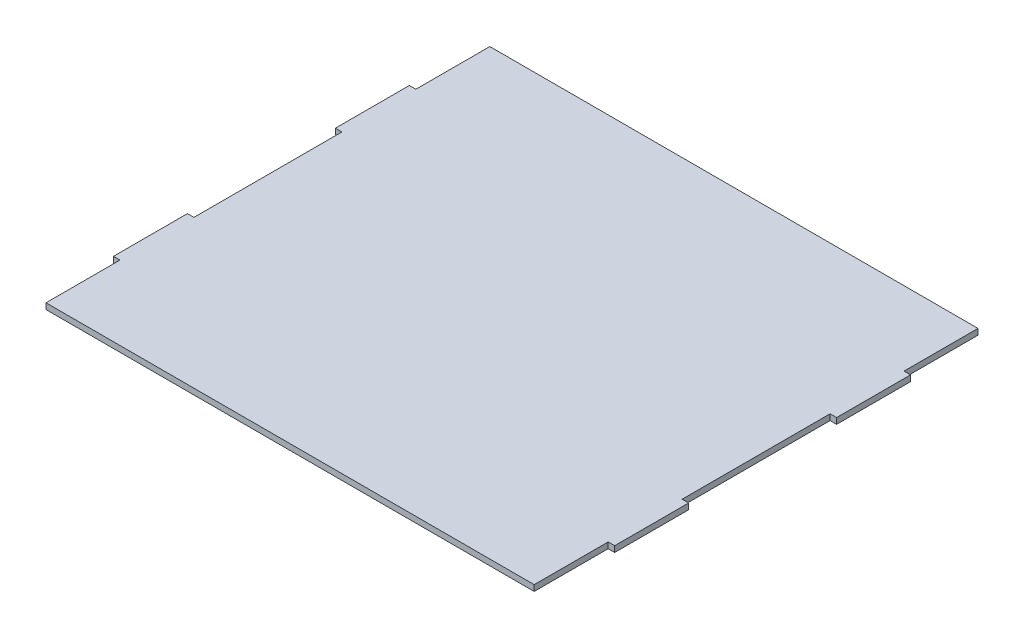
ISO-10303-21;
HEADER;
FILE_DESCRIPTION(('STEP AP214'),'2;1');
FILE_NAME('part.step','',(''),(''),'','','');
FILE_SCHEMA(('AUTOMOTIVE_DESIGN { 1 0 10303 214 1 1 1 1 }'));
ENDSEC;
DATA;
#1=APPLICATION_CONTEXT('core data for automotive mechanical design processes');
#2=APPLICATION_PROTOCOL_DEFINITION('international standard','automotive_design',2000,#1);
#3=PRODUCT_CONTEXT('',#1,'mechanical');
#4=PRODUCT('Part','Part','',(#3));
#5=PRODUCT_RELATED_PRODUCT_CATEGORY('part','',(#4));
#6=PRODUCT_DEFINITION_FORMATION('','',#4);
#7=PRODUCT_DEFINITION_CONTEXT('part definition',#1,'design');
#8=PRODUCT_DEFINITION('design','',#6,#7);
#9=PRODUCT_DEFINITION_SHAPE('','',#8);
#10=(LENGTH_UNIT() NAMED_UNIT(*) SI_UNIT(.MILLI.,.METRE.));
#11=(NAMED_UNIT(*) PLANE_ANGLE_UNIT() SI_UNIT($,.RADIAN.));
#12=(NAMED_UNIT(*) SI_UNIT($,.STERADIAN.) SOLID_ANGLE_UNIT());
#13=UNCERTAINTY_MEASURE_WITH_UNIT(LENGTH_MEASURE(1.E-05),#10,'distance_accuracy_value','');
#14=(GEOMETRIC_REPRESENTATION_CONTEXT(3) GLOBAL_UNCERTAINTY_ASSIGNED_CONTEXT((#13)) GLOBAL_UNIT_ASSIGNED_CONTEXT((#10,
#11,#12)) REPRESENTATION_CONTEXT('',''));
#15=CARTESIAN_POINT('',(0.,0.,0.));
#16=DIRECTION('',(0.,0.,1.));
#17=DIRECTION('',(1.,0.,0.));
#18=AXIS2_PLACEMENT_3D('',#15,#16,#17);
#19=CARTESIAN_POINT('',(84.7,2.,-75.));
#20=DIRECTION('',(-1.,0.,0.));
#21=DIRECTION('',(0.,0.,1.));
#22=AXIS2_PLACEMENT_3D('',#19,#20,#21);
#23=PLANE('',#22);
#24=DIRECTION('',(0.,0.,-1.));
#25=VECTOR('',#24,1.);
#26=CARTESIAN_POINT('',(84.7,2.,-75.));
#27=LINE('',#26,#25);
#28=CARTESIAN_POINT('',(84.7000000000008,2.,50.));
#29=VERTEX_POINT('',#28);
#30=CARTESIAN_POINT('',(84.7000000000007,2.,25.));
#31=VERTEX_POINT('',#30);
#32=EDGE_CURVE('E243',#29,#31,#27,.T.);
#33=ORIENTED_EDGE('',*,*,#32,.F.);
#34=DIRECTION('',(0.,1.,0.));
#35=VECTOR('',#34,1.);
#36=CARTESIAN_POINT('',(84.7000000000008,0.,50.));
#37=LINE('',#36,#35);
#38=CARTESIAN_POINT('',(84.7000000000008,0.,50.));
#39=VERTEX_POINT('',#38);
#40=EDGE_CURVE('E369',#39,#29,#37,.T.);
#41=ORIENTED_EDGE('',*,*,#40,.F.);
#42=DIRECTION('',(0.,0.,-1.));
#43=VECTOR('',#42,1.);
#44=CARTESIAN_POINT('',(84.7,0.,-75.));
#45=LINE('',#44,#43);
#46=CARTESIAN_POINT('',(84.7000000000007,0.,25.));
#47=VERTEX_POINT('',#46);
#48=EDGE_CURVE('E209',#39,#47,#45,.T.);
#49=ORIENTED_EDGE('',*,*,#48,.T.);
#50=DIRECTION('',(0.,1.,0.));
#51=VECTOR('',#50,1.);
#52=CARTESIAN_POINT('',(84.7000000000007,0.,25.));
#53=LINE('',#52,#51);
#54=EDGE_CURVE('E365',#47,#31,#53,.T.);
#55=ORIENTED_EDGE('',*,*,#54,.T.);
#56=EDGE_LOOP('',(#33,#41,#49,#55));
#57=FACE_BOUND('',#56,.T.);
#58=ADVANCED_FACE('F43',(#57),#23,.F.);
#59=CARTESIAN_POINT('',(-84.7,2.,-75.));
#60=DIRECTION('',(1.,0.,0.));
#61=DIRECTION('',(0.,0.,-1.));
#62=AXIS2_PLACEMENT_3D('',#59,#60,#61);
#63=PLANE('',#62);
#64=DIRECTION('',(0.,0.,1.));
#65=VECTOR('',#64,1.);
#66=CARTESIAN_POINT('',(-84.7,2.,-75.));
#67=LINE('',#66,#65);
#68=CARTESIAN_POINT('',(-84.7,2.,-50.));
#69=VERTEX_POINT('',#68);
#70=CARTESIAN_POINT('',(-84.7,2.,-25.));
#71=VERTEX_POINT('',#70);
#72=EDGE_CURVE('E53',#69,#71,#67,.T.);
#73=ORIENTED_EDGE('',*,*,#72,.F.);
#74=DIRECTION('',(0.,1.,0.));
#75=VECTOR('',#74,1.);
#76=CARTESIAN_POINT('',(-84.7,0.,-50.));
#77=LINE('',#76,#75);
#78=CARTESIAN_POINT('',(-84.7,0.,-50.));
#79=VERTEX_POINT('',#78);
#80=EDGE_CURVE('E274',#79,#69,#77,.T.);
#81=ORIENTED_EDGE('',*,*,#80,.F.);
#82=DIRECTION('',(0.,0.,1.));
#83=VECTOR('',#82,1.);
#84=CARTESIAN_POINT('',(-84.7,0.,-75.));
#85=LINE('',#84,#83);
#86=CARTESIAN_POINT('',(-84.7,0.,-25.));
#87=VERTEX_POINT('',#86);
#88=EDGE_CURVE('E225',#79,#87,#85,.T.);
#89=ORIENTED_EDGE('',*,*,#88,.T.);
#90=DIRECTION('',(0.,1.,0.));
#91=VECTOR('',#90,1.);
#92=CARTESIAN_POINT('',(-84.7,0.,-25.));
#93=LINE('',#92,#91);
#94=EDGE_CURVE('E275',#87,#71,#93,.T.);
#95=ORIENTED_EDGE('',*,*,#94,.T.);
#96=EDGE_LOOP('',(#73,#81,#89,#95));
#97=FACE_BOUND('',#96,.T.);
#98=ADVANCED_FACE('F273',(#97),#63,.F.);
#99=CARTESIAN_POINT('',(84.7000000000003,0.,-25.));
#100=VERTEX_POINT('',#99);
#101=CARTESIAN_POINT('',(84.7000000000001,0.,-50.));
#102=VERTEX_POINT('',#101);
#103=EDGE_CURVE('E201',#100,#102,#45,.T.);
#104=ORIENTED_EDGE('',*,*,#103,.T.);
#105=DIRECTION('',(0.,1.,0.));
#106=VECTOR('',#105,1.);
#107=CARTESIAN_POINT('',(84.7000000000001,0.,-50.));
#108=LINE('',#107,#106);
#109=CARTESIAN_POINT('',(84.7000000000001,2.,-50.));
#110=VERTEX_POINT('',#109);
#111=EDGE_CURVE('E210',#102,#110,#108,.T.);
#112=ORIENTED_EDGE('',*,*,#111,.T.);
#113=CARTESIAN_POINT('',(84.7000000000003,2.,-25.));
#114=VERTEX_POINT('',#113);
#115=EDGE_CURVE('E203',#114,#110,#27,.T.);
#116=ORIENTED_EDGE('',*,*,#115,.F.);
#117=DIRECTION('',(0.,1.,0.));
#118=VECTOR('',#117,1.);
#119=CARTESIAN_POINT('',(84.7000000000003,0.,-25.));
#120=LINE('',#119,#118);
#121=EDGE_CURVE('E187',#100,#114,#120,.T.);
#122=ORIENTED_EDGE('',*,*,#121,.F.);
#123=EDGE_LOOP('',(#104,#112,#116,#122));
#124=FACE_BOUND('',#123,.T.);
#125=ADVANCED_FACE('F45',(#124),#23,.F.);
#126=CARTESIAN_POINT('',(-84.7,2.,-75.));
#127=DIRECTION('',(0.,0.,1.));
#128=DIRECTION('',(1.,0.,0.));
#129=AXIS2_PLACEMENT_3D('',#126,#127,#128);
#130=PLANE('',#129);
#131=DIRECTION('',(-1.,0.,0.));
#132=VECTOR('',#131,1.);
#133=CARTESIAN_POINT('',(-84.7,2.,-75.));
#134=LINE('',#133,#132);
#135=CARTESIAN_POINT('',(82.4999999999999,2.,-74.9999999999999));
#136=VERTEX_POINT('',#135);
#137=CARTESIAN_POINT('',(-82.5,2.,-75.));
#138=VERTEX_POINT('',#137);
#139=EDGE_CURVE('E249',#136,#138,#134,.T.);
#140=ORIENTED_EDGE('',*,*,#139,.F.);
#141=DIRECTION('',(0.,1.,0.));
#142=VECTOR('',#141,1.);
#143=CARTESIAN_POINT('',(82.4999999999999,0.,-74.9999999999999));
#144=LINE('',#143,#142);
#145=CARTESIAN_POINT('',(82.4999999999999,0.,-74.9999999999999));
#146=VERTEX_POINT('',#145);
#147=EDGE_CURVE('E378',#146,#136,#144,.T.);
#148=ORIENTED_EDGE('',*,*,#147,.F.);
#149=DIRECTION('',(-1.,0.,0.));
#150=VECTOR('',#149,1.);
#151=CARTESIAN_POINT('',(-84.7,0.,-75.));
#152=LINE('',#151,#150);
#153=CARTESIAN_POINT('',(-82.5,0.,-75.));
#154=VERTEX_POINT('',#153);
#155=EDGE_CURVE('E215',#146,#154,#152,.T.);
#156=ORIENTED_EDGE('',*,*,#155,.T.);
#157=DIRECTION('',(0.,1.,0.));
#158=VECTOR('',#157,1.);
#159=CARTESIAN_POINT('',(-82.5,0.,-75.));
#160=LINE('',#159,#158);
#161=EDGE_CURVE('E292',#154,#138,#160,.T.);
#162=ORIENTED_EDGE('',*,*,#161,.T.);
#163=EDGE_LOOP('',(#140,#148,#156,#162));
#164=FACE_BOUND('',#163,.T.);
#165=ADVANCED_FACE('F462',(#164),#130,.F.);
#166=CARTESIAN_POINT('',(-84.7,0.,25.));
#167=VERTEX_POINT('',#166);
#168=CARTESIAN_POINT('',(-84.7,0.,50.));
#169=VERTEX_POINT('',#168);
#170=EDGE_CURVE('E222',#167,#169,#85,.T.);
#171=ORIENTED_EDGE('',*,*,#170,.T.);
#172=DIRECTION('',(0.,1.,0.));
#173=VECTOR('',#172,1.);
#174=CARTESIAN_POINT('',(-84.7,0.,50.));
#175=LINE('',#174,#173);
#176=CARTESIAN_POINT('',(-84.7,2.,50.));
#177=VERTEX_POINT('',#176);
#178=EDGE_CURVE('E302',#169,#177,#175,.T.);
#179=ORIENTED_EDGE('',*,*,#178,.T.);
#180=CARTESIAN_POINT('',(-84.7,2.,25.));
#181=VERTEX_POINT('',#180);
#182=EDGE_CURVE('E256',#181,#177,#67,.T.);
#183=ORIENTED_EDGE('',*,*,#182,.F.);
#184=DIRECTION('',(0.,1.,0.));
#185=VECTOR('',#184,1.);
#186=CARTESIAN_POINT('',(-84.7,0.,25.));
#187=LINE('',#186,#185);
#188=EDGE_CURVE('E333',#167,#181,#187,.T.);
#189=ORIENTED_EDGE('',*,*,#188,.F.);
#190=EDGE_LOOP('',(#171,#179,#183,#189));
#191=FACE_BOUND('',#190,.T.);
#192=ADVANCED_FACE('F355',(#191),#63,.F.);
#193=CARTESIAN_POINT('',(-84.7,2.,75.));
#194=DIRECTION('',(0.,0.,-1.));
#195=DIRECTION('',(-1.,0.,0.));
#196=AXIS2_PLACEMENT_3D('',#193,#194,#195);
#197=PLANE('',#196);
#198=DIRECTION('',(1.,0.,0.));
#199=VECTOR('',#198,1.);
#200=CARTESIAN_POINT('',(-84.7,0.,75.));
#201=LINE('',#200,#199);
#202=CARTESIAN_POINT('',(-82.5,0.,75.));
#203=VERTEX_POINT('',#202);
#204=CARTESIAN_POINT('',(82.500000000001,0.,75.0000000000001));
#205=VERTEX_POINT('',#204);
#206=EDGE_CURVE('E47',#203,#205,#201,.T.);
#207=ORIENTED_EDGE('',*,*,#206,.T.);
#208=DIRECTION('',(0.,1.,0.));
#209=VECTOR('',#208,1.);
#210=CARTESIAN_POINT('',(82.500000000001,0.,75.0000000000001));
#211=LINE('',#210,#209);
#212=CARTESIAN_POINT('',(82.500000000001,2.,75.0000000000001));
#213=VERTEX_POINT('',#212);
#214=EDGE_CURVE('E375',#205,#213,#211,.T.);
#215=ORIENTED_EDGE('',*,*,#214,.T.);
#216=DIRECTION('',(1.,0.,0.));
#217=VECTOR('',#216,1.);
#218=CARTESIAN_POINT('',(-84.7,2.,75.));
#219=LINE('',#218,#217);
#220=CARTESIAN_POINT('',(-82.5,2.,75.));
#221=VERTEX_POINT('',#220);
#222=EDGE_CURVE('E11',#221,#213,#219,.T.);
#223=ORIENTED_EDGE('',*,*,#222,.F.);
#224=DIRECTION('',(0.,1.,0.));
#225=VECTOR('',#224,1.);
#226=CARTESIAN_POINT('',(-82.5,0.,75.));
#227=LINE('',#226,#225);
#228=EDGE_CURVE('E296',#203,#221,#227,.T.);
#229=ORIENTED_EDGE('',*,*,#228,.F.);
#230=EDGE_LOOP('',(#207,#215,#223,#229));
#231=FACE_BOUND('',#230,.T.);
#232=ADVANCED_FACE('F441',(#231),#197,.F.);
#233=CARTESIAN_POINT('',(0.,2.,0.));
#234=DIRECTION('',(0.,1.,0.));
#235=DIRECTION('',(0.,0.,1.));
#236=AXIS2_PLACEMENT_3D('',#233,#234,#235);
#237=PLANE('',#236);
#238=DIRECTION('',(1.,0.,0.));
#239=VECTOR('',#238,1.);
#240=CARTESIAN_POINT('',(82.5000000000001,2.,-50.));
#241=LINE('',#240,#239);
#242=CARTESIAN_POINT('',(82.5000000000001,2.,-50.));
#243=VERTEX_POINT('',#242);
#244=EDGE_CURVE('E195',#243,#110,#241,.T.);
#245=ORIENTED_EDGE('',*,*,#244,.F.);
#246=DIRECTION('',(0.,0.,1.));
#247=VECTOR('',#246,1.);
#248=CARTESIAN_POINT('',(82.5000000000001,2.,-50.));
#249=LINE('',#248,#247);
#250=EDGE_CURVE('E385',#136,#243,#249,.T.);
#251=ORIENTED_EDGE('',*,*,#250,.F.);
#252=ORIENTED_EDGE('',*,*,#139,.T.);
#253=DIRECTION('',(0.,0.,-1.));
#254=VECTOR('',#253,1.);
#255=CARTESIAN_POINT('',(-82.5,2.,-50.));
#256=LINE('',#255,#254);
#257=CARTESIAN_POINT('',(-82.5,2.,-50.));
#258=VERTEX_POINT('',#257);
#259=EDGE_CURVE('E312',#258,#138,#256,.T.);
#260=ORIENTED_EDGE('',*,*,#259,.F.);
#261=DIRECTION('',(1.,0.,0.));
#262=VECTOR('',#261,1.);
#263=CARTESIAN_POINT('',(-82.5,2.,-50.));
#264=LINE('',#263,#262);
#265=EDGE_CURVE('E272',#69,#258,#264,.T.);
#266=ORIENTED_EDGE('',*,*,#265,.F.);
#267=ORIENTED_EDGE('',*,*,#72,.T.);
#268=DIRECTION('',(-1.,0.,0.));
#269=VECTOR('',#268,1.);
#270=CARTESIAN_POINT('',(-84.7,2.,-25.));
#271=LINE('',#270,#269);
#272=CARTESIAN_POINT('',(-82.5,2.,-25.));
#273=VERTEX_POINT('',#272);
#274=EDGE_CURVE('E269',#273,#71,#271,.T.);
#275=ORIENTED_EDGE('',*,*,#274,.F.);
#276=DIRECTION('',(0.,0.,-1.));
#277=VECTOR('',#276,1.);
#278=CARTESIAN_POINT('',(-82.5,2.,-25.));
#279=LINE('',#278,#277);
#280=CARTESIAN_POINT('',(-82.5,2.,25.));
#281=VERTEX_POINT('',#280);
#282=EDGE_CURVE('E319',#281,#273,#279,.T.);
#283=ORIENTED_EDGE('',*,*,#282,.F.);
#284=DIRECTION('',(1.,0.,0.));
#285=VECTOR('',#284,1.);
#286=CARTESIAN_POINT('',(-82.5,2.,25.));
#287=LINE('',#286,#285);
#288=EDGE_CURVE('E323',#181,#281,#287,.T.);
#289=ORIENTED_EDGE('',*,*,#288,.F.);
#290=ORIENTED_EDGE('',*,*,#182,.T.);
#291=DIRECTION('',(-1.,0.,0.));
#292=VECTOR('',#291,1.);
#293=CARTESIAN_POINT('',(-82.5,2.,50.));
#294=LINE('',#293,#292);
#295=CARTESIAN_POINT('',(-82.5,2.,50.));
#296=VERTEX_POINT('',#295);
#297=EDGE_CURVE('E305',#296,#177,#294,.T.);
#298=ORIENTED_EDGE('',*,*,#297,.F.);
#299=DIRECTION('',(0.,0.,-1.));
#300=VECTOR('',#299,1.);
#301=CARTESIAN_POINT('',(-82.5,2.,50.));
#302=LINE('',#301,#300);
#303=EDGE_CURVE('E308',#221,#296,#302,.T.);
#304=ORIENTED_EDGE('',*,*,#303,.F.);
#305=ORIENTED_EDGE('',*,*,#222,.T.);
#306=DIRECTION('',(0.,0.,1.));
#307=VECTOR('',#306,1.);
#308=CARTESIAN_POINT('',(82.5000000000008,2.,50.));
#309=LINE('',#308,#307);
#310=CARTESIAN_POINT('',(82.5000000000008,2.,50.));
#311=VERTEX_POINT('',#310);
#312=EDGE_CURVE('E389',#311,#213,#309,.T.);
#313=ORIENTED_EDGE('',*,*,#312,.F.);
#314=DIRECTION('',(-1.,0.,0.));
#315=VECTOR('',#314,1.);
#316=CARTESIAN_POINT('',(82.5000000000008,2.,50.));
#317=LINE('',#316,#315);
#318=EDGE_CURVE('E392',#29,#311,#317,.T.);
#319=ORIENTED_EDGE('',*,*,#318,.F.);
#320=ORIENTED_EDGE('',*,*,#32,.T.);
#321=DIRECTION('',(1.,0.,0.));
#322=VECTOR('',#321,1.);
#323=CARTESIAN_POINT('',(84.7000000000007,2.,25.));
#324=LINE('',#323,#322);
#325=CARTESIAN_POINT('',(82.5000000000007,2.,25.0000000000001));
#326=VERTEX_POINT('',#325);
#327=EDGE_CURVE('E396',#326,#31,#324,.T.);
#328=ORIENTED_EDGE('',*,*,#327,.F.);
#329=DIRECTION('',(0.,0.,1.));
#330=VECTOR('',#329,1.);
#331=CARTESIAN_POINT('',(82.5000000000007,2.,25.0000000000001));
#332=LINE('',#331,#330);
#333=CARTESIAN_POINT('',(82.5000000000003,2.,-25.));
#334=VERTEX_POINT('',#333);
#335=EDGE_CURVE('E399',#334,#326,#332,.T.);
#336=ORIENTED_EDGE('',*,*,#335,.F.);
#337=DIRECTION('',(-1.,0.,0.));
#338=VECTOR('',#337,1.);
#339=CARTESIAN_POINT('',(82.5000000000003,2.,-25.));
#340=LINE('',#339,#338);
#341=EDGE_CURVE('E327',#114,#334,#340,.T.);
#342=ORIENTED_EDGE('',*,*,#341,.F.);
#343=ORIENTED_EDGE('',*,*,#115,.T.);
#344=EDGE_LOOP('',(#245,#251,#252,#260,#266,#267,#275,#283,#289,#290,#298,#304,#305,#313,#319,
#320,#328,#336,#342,#343));
#345=FACE_BOUND('',#344,.T.);
#346=ADVANCED_FACE('F267',(#345),#237,.T.);
#347=CARTESIAN_POINT('',(0.,0.,0.));
#348=DIRECTION('',(0.,1.,0.));
#349=DIRECTION('',(0.,0.,1.));
#350=AXIS2_PLACEMENT_3D('',#347,#348,#349);
#351=PLANE('',#350);
#352=DIRECTION('',(0.,0.,1.));
#353=VECTOR('',#352,1.);
#354=CARTESIAN_POINT('',(82.5000000000001,0.,-50.));
#355=LINE('',#354,#353);
#356=CARTESIAN_POINT('',(82.5000000000001,0.,-50.));
#357=VERTEX_POINT('',#356);
#358=EDGE_CURVE('E407',#146,#357,#355,.T.);
#359=ORIENTED_EDGE('',*,*,#358,.T.);
#360=DIRECTION('',(1.,0.,0.));
#361=VECTOR('',#360,1.);
#362=CARTESIAN_POINT('',(82.5000000000001,0.,-50.));
#363=LINE('',#362,#361);
#364=EDGE_CURVE('E61',#357,#102,#363,.T.);
#365=ORIENTED_EDGE('',*,*,#364,.T.);
#366=ORIENTED_EDGE('',*,*,#103,.F.);
#367=DIRECTION('',(-1.,0.,0.));
#368=VECTOR('',#367,1.);
#369=CARTESIAN_POINT('',(82.5000000000003,0.,-25.));
#370=LINE('',#369,#368);
#371=CARTESIAN_POINT('',(82.5000000000003,0.,-25.));
#372=VERTEX_POINT('',#371);
#373=EDGE_CURVE('E183',#100,#372,#370,.T.);
#374=ORIENTED_EDGE('',*,*,#373,.T.);
#375=DIRECTION('',(0.,0.,1.));
#376=VECTOR('',#375,1.);
#377=CARTESIAN_POINT('',(82.5000000000007,0.,25.0000000000001));
#378=LINE('',#377,#376);
#379=CARTESIAN_POINT('',(82.5000000000007,0.,25.0000000000001));
#380=VERTEX_POINT('',#379);
#381=EDGE_CURVE('E194',#372,#380,#378,.T.);
#382=ORIENTED_EDGE('',*,*,#381,.T.);
#383=DIRECTION('',(1.,0.,0.));
#384=VECTOR('',#383,1.);
#385=CARTESIAN_POINT('',(84.7000000000007,0.,25.));
#386=LINE('',#385,#384);
#387=EDGE_CURVE('E416',#380,#47,#386,.T.);
#388=ORIENTED_EDGE('',*,*,#387,.T.);
#389=ORIENTED_EDGE('',*,*,#48,.F.);
#390=DIRECTION('',(-1.,0.,0.));
#391=VECTOR('',#390,1.);
#392=CARTESIAN_POINT('',(82.5000000000008,0.,50.));
#393=LINE('',#392,#391);
#394=CARTESIAN_POINT('',(82.5000000000008,0.,50.));
#395=VERTEX_POINT('',#394);
#396=EDGE_CURVE('E412',#39,#395,#393,.T.);
#397=ORIENTED_EDGE('',*,*,#396,.T.);
#398=DIRECTION('',(0.,0.,1.));
#399=VECTOR('',#398,1.);
#400=CARTESIAN_POINT('',(82.5000000000008,0.,50.));
#401=LINE('',#400,#399);
#402=EDGE_CURVE('E69',#395,#205,#401,.T.);
#403=ORIENTED_EDGE('',*,*,#402,.T.);
#404=ORIENTED_EDGE('',*,*,#206,.F.);
#405=DIRECTION('',(0.,0.,-1.));
#406=VECTOR('',#405,1.);
#407=CARTESIAN_POINT('',(-82.5,0.,50.));
#408=LINE('',#407,#406);
#409=CARTESIAN_POINT('',(-82.5,0.,50.));
#410=VERTEX_POINT('',#409);
#411=EDGE_CURVE('E332',#203,#410,#408,.T.);
#412=ORIENTED_EDGE('',*,*,#411,.T.);
#413=DIRECTION('',(-1.,0.,0.));
#414=VECTOR('',#413,1.);
#415=CARTESIAN_POINT('',(-82.5,0.,50.));
#416=LINE('',#415,#414);
#417=EDGE_CURVE('E328',#410,#169,#416,.T.);
#418=ORIENTED_EDGE('',*,*,#417,.T.);
#419=ORIENTED_EDGE('',*,*,#170,.F.);
#420=DIRECTION('',(1.,0.,0.));
#421=VECTOR('',#420,1.);
#422=CARTESIAN_POINT('',(-82.5,0.,25.));
#423=LINE('',#422,#421);
#424=CARTESIAN_POINT('',(-82.5,0.,25.));
#425=VERTEX_POINT('',#424);
#426=EDGE_CURVE('E252',#167,#425,#423,.T.);
#427=ORIENTED_EDGE('',*,*,#426,.T.);
#428=DIRECTION('',(0.,0.,-1.));
#429=VECTOR('',#428,1.);
#430=CARTESIAN_POINT('',(-82.5,0.,-25.));
#431=LINE('',#430,#429);
#432=CARTESIAN_POINT('',(-82.5,0.,-25.));
#433=VERTEX_POINT('',#432);
#434=EDGE_CURVE('E347',#425,#433,#431,.T.);
#435=ORIENTED_EDGE('',*,*,#434,.T.);
#436=DIRECTION('',(-1.,0.,0.));
#437=VECTOR('',#436,1.);
#438=CARTESIAN_POINT('',(-84.7,0.,-25.));
#439=LINE('',#438,#437);
#440=EDGE_CURVE('E345',#433,#87,#439,.T.);
#441=ORIENTED_EDGE('',*,*,#440,.T.);
#442=ORIENTED_EDGE('',*,*,#88,.F.);
#443=DIRECTION('',(1.,0.,0.));
#444=VECTOR('',#443,1.);
#445=CARTESIAN_POINT('',(-82.5,0.,-50.));
#446=LINE('',#445,#444);
#447=CARTESIAN_POINT('',(-82.5,0.,-50.));
#448=VERTEX_POINT('',#447);
#449=EDGE_CURVE('E341',#79,#448,#446,.T.);
#450=ORIENTED_EDGE('',*,*,#449,.T.);
#451=DIRECTION('',(0.,0.,-1.));
#452=VECTOR('',#451,1.);
#453=CARTESIAN_POINT('',(-82.5,0.,-50.));
#454=LINE('',#453,#452);
#455=EDGE_CURVE('E337',#448,#154,#454,.T.);
#456=ORIENTED_EDGE('',*,*,#455,.T.);
#457=ORIENTED_EDGE('',*,*,#155,.F.);
#458=EDGE_LOOP('',(#359,#365,#366,#374,#382,#388,#389,#397,#403,#404,#412,#418,#419,#427,#435,
#441,#442,#450,#456,#457));
#459=FACE_BOUND('',#458,.T.);
#460=ADVANCED_FACE('F207',(#459),#351,.F.);
#461=CARTESIAN_POINT('',(-82.5,0.,25.));
#462=DIRECTION('',(0.,0.,1.));
#463=DIRECTION('',(1.,0.,0.));
#464=AXIS2_PLACEMENT_3D('',#461,#462,#463);
#465=PLANE('',#464);
#466=ORIENTED_EDGE('',*,*,#288,.T.);
#467=DIRECTION('',(0.,1.,0.));
#468=VECTOR('',#467,1.);
#469=CARTESIAN_POINT('',(-82.5,0.,25.));
#470=LINE('',#469,#468);
#471=EDGE_CURVE('E284',#425,#281,#470,.T.);
#472=ORIENTED_EDGE('',*,*,#471,.F.);
#473=ORIENTED_EDGE('',*,*,#426,.F.);
#474=ORIENTED_EDGE('',*,*,#188,.T.);
#475=EDGE_LOOP('',(#466,#472,#473,#474));
#476=FACE_BOUND('',#475,.T.);
#477=ADVANCED_FACE('F354',(#476),#465,.F.);
#478=CARTESIAN_POINT('',(-82.5,0.,-25.));
#479=DIRECTION('',(1.,0.,0.));
#480=DIRECTION('',(0.,0.,-1.));
#481=AXIS2_PLACEMENT_3D('',#478,#479,#480);
#482=PLANE('',#481);
#483=ORIENTED_EDGE('',*,*,#282,.T.);
#484=DIRECTION('',(0.,1.,0.));
#485=VECTOR('',#484,1.);
#486=CARTESIAN_POINT('',(-82.5,0.,-25.));
#487=LINE('',#486,#485);
#488=EDGE_CURVE('E280',#433,#273,#487,.T.);
#489=ORIENTED_EDGE('',*,*,#488,.F.);
#490=ORIENTED_EDGE('',*,*,#434,.F.);
#491=ORIENTED_EDGE('',*,*,#471,.T.);
#492=EDGE_LOOP('',(#483,#489,#490,#491));
#493=FACE_BOUND('',#492,.T.);
#494=ADVANCED_FACE('F490',(#493),#482,.F.);
#495=CARTESIAN_POINT('',(-84.7,0.,-25.));
#496=DIRECTION('',(0.,0.,-1.));
#497=DIRECTION('',(-1.,0.,0.));
#498=AXIS2_PLACEMENT_3D('',#495,#496,#497);
#499=PLANE('',#498);
#500=ORIENTED_EDGE('',*,*,#274,.T.);
#501=ORIENTED_EDGE('',*,*,#94,.F.);
#502=ORIENTED_EDGE('',*,*,#440,.F.);
#503=ORIENTED_EDGE('',*,*,#488,.T.);
#504=EDGE_LOOP('',(#500,#501,#502,#503));
#505=FACE_BOUND('',#504,.T.);
#506=ADVANCED_FACE('F497',(#505),#499,.F.);
#507=CARTESIAN_POINT('',(-82.5,0.,-50.));
#508=DIRECTION('',(0.,0.,1.));
#509=DIRECTION('',(1.,0.,0.));
#510=AXIS2_PLACEMENT_3D('',#507,#508,#509);
#511=PLANE('',#510);
#512=ORIENTED_EDGE('',*,*,#265,.T.);
#513=DIRECTION('',(0.,1.,0.));
#514=VECTOR('',#513,1.);
#515=CARTESIAN_POINT('',(-82.5,0.,-50.));
#516=LINE('',#515,#514);
#517=EDGE_CURVE('E286',#448,#258,#516,.T.);
#518=ORIENTED_EDGE('',*,*,#517,.F.);
#519=ORIENTED_EDGE('',*,*,#449,.F.);
#520=ORIENTED_EDGE('',*,*,#80,.T.);
#521=EDGE_LOOP('',(#512,#518,#519,#520));
#522=FACE_BOUND('',#521,.T.);
#523=ADVANCED_FACE('F452',(#522),#511,.F.);
#524=CARTESIAN_POINT('',(-82.5,0.,-50.));
#525=DIRECTION('',(1.,0.,0.));
#526=DIRECTION('',(0.,0.,-1.));
#527=AXIS2_PLACEMENT_3D('',#524,#525,#526);
#528=PLANE('',#527);
#529=ORIENTED_EDGE('',*,*,#259,.T.);
#530=ORIENTED_EDGE('',*,*,#161,.F.);
#531=ORIENTED_EDGE('',*,*,#455,.F.);
#532=ORIENTED_EDGE('',*,*,#517,.T.);
#533=EDGE_LOOP('',(#529,#530,#531,#532));
#534=FACE_BOUND('',#533,.T.);
#535=ADVANCED_FACE('F445',(#534),#528,.F.);
#536=CARTESIAN_POINT('',(-82.5,0.,50.));
#537=DIRECTION('',(0.,0.,-1.));
#538=DIRECTION('',(-1.,0.,0.));
#539=AXIS2_PLACEMENT_3D('',#536,#537,#538);
#540=PLANE('',#539);
#541=ORIENTED_EDGE('',*,*,#297,.T.);
#542=ORIENTED_EDGE('',*,*,#178,.F.);
#543=ORIENTED_EDGE('',*,*,#417,.F.);
#544=DIRECTION('',(0.,1.,0.));
#545=VECTOR('',#544,1.);
#546=CARTESIAN_POINT('',(-82.5,0.,50.));
#547=LINE('',#546,#545);
#548=EDGE_CURVE('E299',#410,#296,#547,.T.);
#549=ORIENTED_EDGE('',*,*,#548,.T.);
#550=EDGE_LOOP('',(#541,#542,#543,#549));
#551=FACE_BOUND('',#550,.T.);
#552=ADVANCED_FACE('F443',(#551),#540,.F.);
#553=CARTESIAN_POINT('',(-82.5,0.,50.));
#554=DIRECTION('',(1.,0.,0.));
#555=DIRECTION('',(0.,0.,-1.));
#556=AXIS2_PLACEMENT_3D('',#553,#554,#555);
#557=PLANE('',#556);
#558=ORIENTED_EDGE('',*,*,#303,.T.);
#559=ORIENTED_EDGE('',*,*,#548,.F.);
#560=ORIENTED_EDGE('',*,*,#411,.F.);
#561=ORIENTED_EDGE('',*,*,#228,.T.);
#562=EDGE_LOOP('',(#558,#559,#560,#561));
#563=FACE_BOUND('',#562,.T.);
#564=ADVANCED_FACE('F438',(#563),#557,.F.);
#565=CARTESIAN_POINT('',(82.5000000000003,0.,-25.));
#566=DIRECTION('',(0.,0.,-1.));
#567=DIRECTION('',(-1.,0.,0.));
#568=AXIS2_PLACEMENT_3D('',#565,#566,#567);
#569=PLANE('',#568);
#570=ORIENTED_EDGE('',*,*,#341,.T.);
#571=DIRECTION('',(0.,1.,0.));
#572=VECTOR('',#571,1.);
#573=CARTESIAN_POINT('',(82.5000000000003,0.,-25.));
#574=LINE('',#573,#572);
#575=EDGE_CURVE('E189',#372,#334,#574,.T.);
#576=ORIENTED_EDGE('',*,*,#575,.F.);
#577=ORIENTED_EDGE('',*,*,#373,.F.);
#578=ORIENTED_EDGE('',*,*,#121,.T.);
#579=EDGE_LOOP('',(#570,#576,#577,#578));
#580=FACE_BOUND('',#579,.T.);
#581=ADVANCED_FACE('F186',(#580),#569,.F.);
#582=CARTESIAN_POINT('',(82.5000000000007,0.,25.0000000000001));
#583=DIRECTION('',(-1.,0.,0.));
#584=DIRECTION('',(0.,0.,1.));
#585=AXIS2_PLACEMENT_3D('',#582,#583,#584);
#586=PLANE('',#585);
#587=ORIENTED_EDGE('',*,*,#335,.T.);
#588=DIRECTION('',(0.,1.,0.));
#589=VECTOR('',#588,1.);
#590=CARTESIAN_POINT('',(82.5000000000007,0.,25.0000000000001));
#591=LINE('',#590,#589);
#592=EDGE_CURVE('E362',#380,#326,#591,.T.);
#593=ORIENTED_EDGE('',*,*,#592,.F.);
#594=ORIENTED_EDGE('',*,*,#381,.F.);
#595=ORIENTED_EDGE('',*,*,#575,.T.);
#596=EDGE_LOOP('',(#587,#593,#594,#595));
#597=FACE_BOUND('',#596,.T.);
#598=ADVANCED_FACE('F424',(#597),#586,.F.);
#599=CARTESIAN_POINT('',(84.7000000000007,0.,25.));
#600=DIRECTION('',(0.,0.,1.));
#601=DIRECTION('',(1.,0.,0.));
#602=AXIS2_PLACEMENT_3D('',#599,#600,#601);
#603=PLANE('',#602);
#604=ORIENTED_EDGE('',*,*,#327,.T.);
#605=ORIENTED_EDGE('',*,*,#54,.F.);
#606=ORIENTED_EDGE('',*,*,#387,.F.);
#607=ORIENTED_EDGE('',*,*,#592,.T.);
#608=EDGE_LOOP('',(#604,#605,#606,#607));
#609=FACE_BOUND('',#608,.T.);
#610=ADVANCED_FACE('F428',(#609),#603,.F.);
#611=CARTESIAN_POINT('',(82.5000000000008,0.,50.));
#612=DIRECTION('',(0.,0.,-1.));
#613=DIRECTION('',(-1.,0.,0.));
#614=AXIS2_PLACEMENT_3D('',#611,#612,#613);
#615=PLANE('',#614);
#616=ORIENTED_EDGE('',*,*,#318,.T.);
#617=DIRECTION('',(0.,1.,0.));
#618=VECTOR('',#617,1.);
#619=CARTESIAN_POINT('',(82.5000000000008,0.,50.));
#620=LINE('',#619,#618);
#621=EDGE_CURVE('E372',#395,#311,#620,.T.);
#622=ORIENTED_EDGE('',*,*,#621,.F.);
#623=ORIENTED_EDGE('',*,*,#396,.F.);
#624=ORIENTED_EDGE('',*,*,#40,.T.);
#625=EDGE_LOOP('',(#616,#622,#623,#624));
#626=FACE_BOUND('',#625,.T.);
#627=ADVANCED_FACE('F435',(#626),#615,.F.);
#628=CARTESIAN_POINT('',(82.5000000000008,0.,50.));
#629=DIRECTION('',(-1.,0.,0.));
#630=DIRECTION('',(0.,0.,1.));
#631=AXIS2_PLACEMENT_3D('',#628,#629,#630);
#632=PLANE('',#631);
#633=ORIENTED_EDGE('',*,*,#312,.T.);
#634=ORIENTED_EDGE('',*,*,#214,.F.);
#635=ORIENTED_EDGE('',*,*,#402,.F.);
#636=ORIENTED_EDGE('',*,*,#621,.T.);
#637=EDGE_LOOP('',(#633,#634,#635,#636));
#638=FACE_BOUND('',#637,.T.);
#639=ADVANCED_FACE('F565',(#638),#632,.F.);
#640=CARTESIAN_POINT('',(82.5000000000001,0.,-50.));
#641=DIRECTION('',(0.,0.,1.));
#642=DIRECTION('',(1.,0.,0.));
#643=AXIS2_PLACEMENT_3D('',#640,#641,#642);
#644=PLANE('',#643);
#645=ORIENTED_EDGE('',*,*,#244,.T.);
#646=ORIENTED_EDGE('',*,*,#111,.F.);
#647=ORIENTED_EDGE('',*,*,#364,.F.);
#648=DIRECTION('',(0.,1.,0.));
#649=VECTOR('',#648,1.);
#650=CARTESIAN_POINT('',(82.5000000000001,0.,-50.));
#651=LINE('',#650,#649);
#652=EDGE_CURVE('E216',#357,#243,#651,.T.);
#653=ORIENTED_EDGE('',*,*,#652,.T.);
#654=EDGE_LOOP('',(#645,#646,#647,#653));
#655=FACE_BOUND('',#654,.T.);
#656=ADVANCED_FACE('F575',(#655),#644,.F.);
#657=CARTESIAN_POINT('',(82.5000000000001,0.,-50.));
#658=DIRECTION('',(-1.,0.,0.));
#659=DIRECTION('',(0.,0.,1.));
#660=AXIS2_PLACEMENT_3D('',#657,#658,#659);
#661=PLANE('',#660);
#662=ORIENTED_EDGE('',*,*,#250,.T.);
#663=ORIENTED_EDGE('',*,*,#652,.F.);
#664=ORIENTED_EDGE('',*,*,#358,.F.);
#665=ORIENTED_EDGE('',*,*,#147,.T.);
#666=EDGE_LOOP('',(#662,#663,#664,#665));
#667=FACE_BOUND('',#666,.T.);
#668=ADVANCED_FACE('F585',(#667),#661,.F.);
#669=CLOSED_SHELL('',(#58,#98,#125,#165,#192,#232,#346,#460,#477,#494,#506,#523,#535,#552,#564,
#581,#598,#610,#627,#639,#656,#668));
#670=MANIFOLD_SOLID_BREP('B2',#669);
#671=ADVANCED_BREP_SHAPE_REPRESENTATION('',(#18,#670),#14);
#672=SHAPE_DEFINITION_REPRESENTATION(#9,#671);
ENDSEC;
END-ISO-10303-21;
